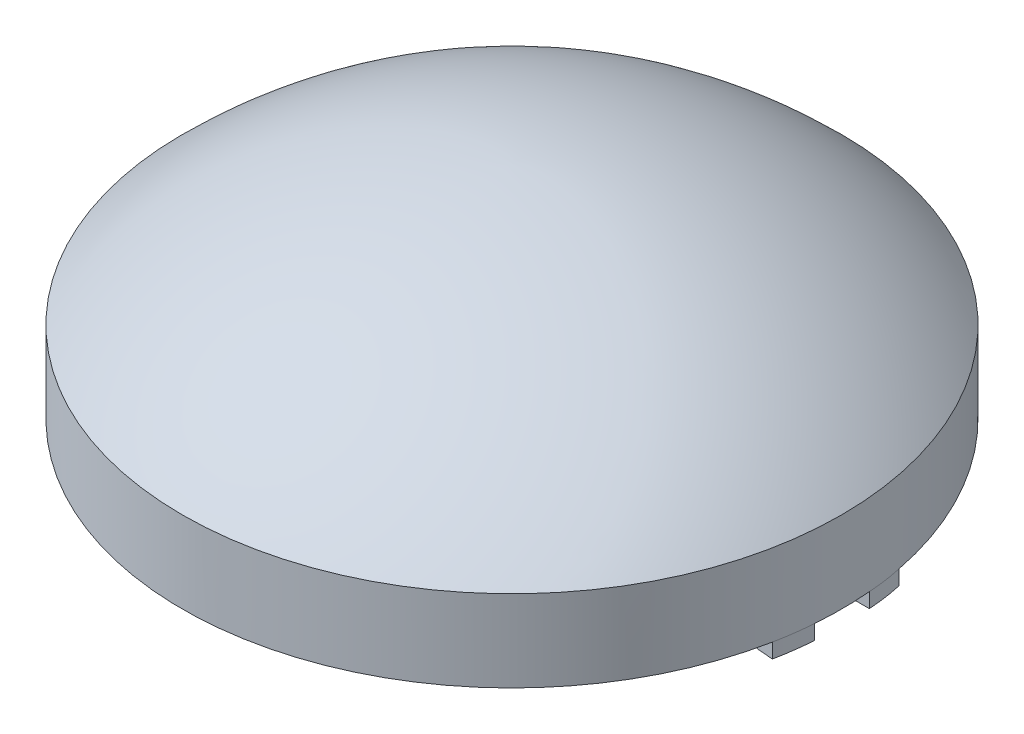
ISO-10303-21;
HEADER;
FILE_DESCRIPTION(('STEP AP214'),'2;1');
FILE_NAME('part.step','',(''),(''),'','','');
FILE_SCHEMA(('AUTOMOTIVE_DESIGN { 1 0 10303 214 1 1 1 1 }'));
ENDSEC;
DATA;
#1=APPLICATION_CONTEXT('core data for automotive mechanical design processes');
#2=APPLICATION_PROTOCOL_DEFINITION('international standard','automotive_design',2000,#1);
#3=PRODUCT_CONTEXT('',#1,'mechanical');
#4=PRODUCT('Part','Part','',(#3));
#5=PRODUCT_RELATED_PRODUCT_CATEGORY('part','',(#4));
#6=PRODUCT_DEFINITION_FORMATION('','',#4);
#7=PRODUCT_DEFINITION_CONTEXT('part definition',#1,'design');
#8=PRODUCT_DEFINITION('design','',#6,#7);
#9=PRODUCT_DEFINITION_SHAPE('','',#8);
#10=(LENGTH_UNIT() NAMED_UNIT(*) SI_UNIT(.MILLI.,.METRE.));
#11=(NAMED_UNIT(*) PLANE_ANGLE_UNIT() SI_UNIT($,.RADIAN.));
#12=(NAMED_UNIT(*) SI_UNIT($,.STERADIAN.) SOLID_ANGLE_UNIT());
#13=UNCERTAINTY_MEASURE_WITH_UNIT(LENGTH_MEASURE(1.E-05),#10,'distance_accuracy_value','');
#14=(GEOMETRIC_REPRESENTATION_CONTEXT(3) GLOBAL_UNCERTAINTY_ASSIGNED_CONTEXT((#13)) GLOBAL_UNIT_ASSIGNED_CONTEXT((#10,
#11,#12)) REPRESENTATION_CONTEXT('',''));
#15=CARTESIAN_POINT('',(0.,0.,0.));
#16=DIRECTION('',(0.,0.,1.));
#17=DIRECTION('',(1.,0.,0.));
#18=AXIS2_PLACEMENT_3D('',#15,#16,#17);
#19=CARTESIAN_POINT('',(0.,0.,0.));
#20=DIRECTION('',(0.,1.,0.));
#21=DIRECTION('',(0.,0.,1.));
#22=AXIS2_PLACEMENT_3D('',#19,#20,#21);
#23=PLANE('',#22);
#24=DIRECTION('',(-0.996339910659909,0.,-0.0854797193853873));
#25=VECTOR('',#24,1.);
#26=CARTESIAN_POINT('',(39.0657739961963,0.,7.6189622205462));
#27=LINE('',#26,#25);
#28=CARTESIAN_POINT('',(39.0657739961963,0.,7.6189622205462));
#29=VERTEX_POINT('',#28);
#30=CARTESIAN_POINT('',(37.0289275629729,0.,7.44421356330558));
#31=VERTEX_POINT('',#30);
#32=EDGE_CURVE('E221',#29,#31,#27,.T.);
#33=ORIENTED_EDGE('',*,*,#32,.F.);
#34=CARTESIAN_POINT('',(0.,0.,0.));
#35=DIRECTION('',(0.,1.,0.));
#36=DIRECTION('',(-0.979868236795601,0.,0.199645281735084));
#37=AXIS2_PLACEMENT_3D('',#34,#35,#36);
#38=CIRCLE('',#37,39.8018);
#39=CARTESIAN_POINT('',(-39.0005199266697,0.,7.94624164370193));
#40=VERTEX_POINT('',#39);
#41=EDGE_CURVE('E487',#40,#29,#38,.T.);
#42=ORIENTED_EDGE('',*,*,#41,.F.);
#43=DIRECTION('',(-0.979860848340807,0.,0.199681541182036));
#44=VECTOR('',#43,1.);
#45=CARTESIAN_POINT('',(-39.0005195872893,0.,7.94624157457244));
#46=LINE('',#45,#44);
#47=CARTESIAN_POINT('',(-37.0094423420242,0.,7.54048868259779));
#48=VERTEX_POINT('',#47);
#49=EDGE_CURVE('E329',#48,#40,#46,.T.);
#50=ORIENTED_EDGE('',*,*,#49,.F.);
#51=CARTESIAN_POINT('',(0.,0.,0.));
#52=DIRECTION('',(0.,1.,0.));
#53=DIRECTION('',(0.,0.,1.));
#54=AXIS2_PLACEMENT_3D('',#51,#52,#53);
#55=CIRCLE('',#54,37.7698);
#56=EDGE_CURVE('E405',#48,#31,#55,.T.);
#57=ORIENTED_EDGE('',*,*,#56,.T.);
#58=EDGE_LOOP('',(#33,#42,#50,#57));
#59=FACE_BOUND('',#58,.T.);
#60=ADVANCED_FACE('F35',(#59),#23,.F.);
#61=DIRECTION('',(1.,0.,0.));
#62=VECTOR('',#61,1.);
#63=CARTESIAN_POINT('',(37.6399716148533,0.,3.12895012313064));
#64=LINE('',#63,#62);
#65=CARTESIAN_POINT('',(37.6399716148533,0.,3.12895012313064));
#66=VERTEX_POINT('',#65);
#67=CARTESIAN_POINT('',(39.6788389715143,0.,3.12895009721406));
#68=VERTEX_POINT('',#67);
#69=EDGE_CURVE('E186',#66,#68,#64,.T.);
#70=ORIENTED_EDGE('',*,*,#69,.F.);
#71=CARTESIAN_POINT('',(37.6059108557315,0.,-3.51472057933188));
#72=VERTEX_POINT('',#71);
#73=EDGE_CURVE('E397',#66,#72,#55,.T.);
#74=ORIENTED_EDGE('',*,*,#73,.T.);
#75=DIRECTION('',(-1.,0.,0.));
#76=VECTOR('',#75,1.);
#77=CARTESIAN_POINT('',(39.6463115874506,0.,-3.51472057933188));
#78=LINE('',#77,#76);
#79=CARTESIAN_POINT('',(39.645807246798,0.,-3.52295182879101));
#80=VERTEX_POINT('',#79);
#81=EDGE_CURVE('E529',#80,#72,#78,.T.);
#82=ORIENTED_EDGE('',*,*,#81,.F.);
#83=CARTESIAN_POINT('',(0.,0.,0.));
#84=DIRECTION('',(0.,1.,0.));
#85=DIRECTION('',(0.996905220901253,0.,0.0786128522559997));
#86=AXIS2_PLACEMENT_3D('',#83,#84,#85);
#87=CIRCLE('',#86,39.8018);
#88=EDGE_CURVE('E460',#68,#80,#87,.T.);
#89=ORIENTED_EDGE('',*,*,#88,.F.);
#90=EDGE_LOOP('',(#70,#74,#82,#89));
#91=FACE_BOUND('',#90,.T.);
#92=ADVANCED_FACE('F567',(#91),#23,.F.);
#93=DIRECTION('',(0.983750056174884,0.,-0.179543384662071));
#94=VECTOR('',#93,1.);
#95=CARTESIAN_POINT('',(37.0548883092305,0.,-7.31389393076296));
#96=LINE('',#95,#94);
#97=CARTESIAN_POINT('',(37.0548883092305,0.,-7.31389393076296));
#98=VERTEX_POINT('',#97);
#99=CARTESIAN_POINT('',(39.0540738889318,0.,-7.67871707746343));
#100=VERTEX_POINT('',#99);
#101=EDGE_CURVE('E194',#98,#100,#96,.T.);
#102=ORIENTED_EDGE('',*,*,#101,.F.);
#103=CARTESIAN_POINT('',(-36.9543952745138,0.,-7.80579668803841));
#104=VERTEX_POINT('',#103);
#105=EDGE_CURVE('E406',#98,#104,#55,.T.);
#106=ORIENTED_EDGE('',*,*,#105,.T.);
#107=DIRECTION('',(1.,0.,0.));
#108=VECTOR('',#107,1.);
#109=CARTESIAN_POINT('',(-39.0288716376096,0.,-7.80579668803842));
#110=LINE('',#109,#108);
#111=CARTESIAN_POINT('',(-39.0288721560761,0.,-7.80579659368505));
#112=VERTEX_POINT('',#111);
#113=EDGE_CURVE('E498',#112,#104,#110,.T.);
#114=ORIENTED_EDGE('',*,*,#113,.F.);
#115=CARTESIAN_POINT('',(0.,0.,0.));
#116=DIRECTION('',(0.,1.,0.));
#117=DIRECTION('',(0.981213730430519,0.,-0.192923858593555));
#118=AXIS2_PLACEMENT_3D('',#115,#116,#117);
#119=CIRCLE('',#118,39.8018);
#120=EDGE_CURVE('E482',#100,#112,#119,.T.);
#121=ORIENTED_EDGE('',*,*,#120,.F.);
#122=EDGE_LOOP('',(#102,#106,#114,#121));
#123=FACE_BOUND('',#122,.T.);
#124=ADVANCED_FACE('F527',(#123),#23,.F.);
#125=DIRECTION('',(0.995689561977879,0.,-0.0927485642384848));
#126=VECTOR('',#125,1.);
#127=CARTESIAN_POINT('',(-39.63004826873,0.,3.69358328160203));
#128=LINE('',#127,#126);
#129=CARTESIAN_POINT('',(-39.6302767977833,0.,3.69360456483683));
#130=VERTEX_POINT('',#129);
#131=CARTESIAN_POINT('',(-37.6068070760117,0.,3.50511819881054));
#132=VERTEX_POINT('',#131);
#133=EDGE_CURVE('E306',#130,#132,#128,.T.);
#134=ORIENTED_EDGE('',*,*,#133,.F.);
#135=CARTESIAN_POINT('',(0.,0.,0.));
#136=DIRECTION('',(0.,1.,0.));
#137=DIRECTION('',(-0.995905534656943,0.,-0.0904000334052383));
#138=AXIS2_PLACEMENT_3D('',#135,#136,#137);
#139=CIRCLE('',#138,39.8018);
#140=CARTESIAN_POINT('',(-39.6390624208985,0.,-3.59810487637087));
#141=VERTEX_POINT('',#140);
#142=EDGE_CURVE('E488',#141,#130,#139,.T.);
#143=ORIENTED_EDGE('',*,*,#142,.F.);
#144=DIRECTION('',(-1.,0.,0.));
#145=VECTOR('',#144,1.);
#146=CARTESIAN_POINT('',(-39.6388310180046,0.,-3.59810488536381));
#147=LINE('',#146,#145);
#148=CARTESIAN_POINT('',(-37.5980243267372,0.,-3.59810488536381));
#149=VERTEX_POINT('',#148);
#150=EDGE_CURVE('E339',#149,#141,#147,.T.);
#151=ORIENTED_EDGE('',*,*,#150,.F.);
#152=EDGE_CURVE('E414',#149,#132,#55,.T.);
#153=ORIENTED_EDGE('',*,*,#152,.T.);
#154=EDGE_LOOP('',(#134,#143,#151,#153));
#155=FACE_BOUND('',#154,.T.);
#156=ADVANCED_FACE('F381',(#155),#23,.F.);
#157=CARTESIAN_POINT('',(0.,9.8552,0.));
#158=DIRECTION('',(0.,-1.,0.));
#159=DIRECTION('',(0.,0.,-1.));
#160=AXIS2_PLACEMENT_3D('',#157,#158,#159);
#161=CYLINDRICAL_SURFACE('',#160,39.8018);
#162=CARTESIAN_POINT('',(0.,9.8552,0.));
#163=DIRECTION('',(0.,1.,0.));
#164=DIRECTION('',(0.,0.,1.));
#165=AXIS2_PLACEMENT_3D('',#162,#163,#164);
#166=CIRCLE('',#165,39.8018);
#167=CARTESIAN_POINT('',(0.,9.8552,39.8018));
#168=VERTEX_POINT('',#167);
#169=EDGE_CURVE('E11',#168,#168,#166,.T.);
#170=ORIENTED_EDGE('',*,*,#169,.F.);
#171=EDGE_LOOP('',(#170));
#172=FACE_BOUND('',#171,.T.);
#173=CARTESIAN_POINT('',(0.,0.,0.));
#174=DIRECTION('',(0.,1.,0.));
#175=DIRECTION('',(-0.980580568609786,0.,-0.196116670543096));
#176=AXIS2_PLACEMENT_3D('',#173,#174,#175);
#177=CIRCLE('',#176,39.8018);
#178=EDGE_CURVE('E47',#112,#141,#177,.T.);
#179=ORIENTED_EDGE('',*,*,#178,.T.);
#180=ORIENTED_EDGE('',*,*,#142,.T.);
#181=CARTESIAN_POINT('',(-1.003967386232,0.,0.148619103940041));
#182=DIRECTION('',(0.,-1.,0.));
#183=DIRECTION('',(-0.988147540773018,0.,0.153507125776744));
#184=AXIS2_PLACEMENT_3D('',#181,#182,#183);
#185=CIRCLE('',#184,38.7884118695543);
#186=CARTESIAN_POINT('',(-39.3319027774762,0.,6.10280202440706));
#187=VERTEX_POINT('',#186);
#188=EDGE_CURVE('E568',#187,#130,#185,.T.);
#189=ORIENTED_EDGE('',*,*,#188,.F.);
#190=CARTESIAN_POINT('',(-1.003967386232,0.,0.148619103940041));
#191=DIRECTION('',(0.,-1.,0.));
#192=DIRECTION('',(-0.979585148493317,0.,0.201029691467024));
#193=AXIS2_PLACEMENT_3D('',#190,#191,#192);
#194=CIRCLE('',#193,38.7884118695543);
#195=EDGE_CURVE('E314',#40,#187,#194,.T.);
#196=ORIENTED_EDGE('',*,*,#195,.F.);
#197=ORIENTED_EDGE('',*,*,#41,.T.);
#198=CARTESIAN_POINT('',(0.957925034473089,0.,0.130748281442299));
#199=DIRECTION('',(0.,-1.,0.));
#200=DIRECTION('',(0.989814643666676,0.,0.142362112877727));
#201=AXIS2_PLACEMENT_3D('',#198,#199,#200);
#202=CIRCLE('',#201,38.8366000119385);
#203=CARTESIAN_POINT('',(39.3981772694796,0.,5.65949608927648));
#204=VERTEX_POINT('',#203);
#205=EDGE_CURVE('E189',#204,#29,#202,.T.);
#206=ORIENTED_EDGE('',*,*,#205,.F.);
#207=CARTESIAN_POINT('',(0.957925034473089,0.,0.130748281442299));
#208=DIRECTION('',(0.,-1.,0.));
#209=DIRECTION('',(0.997015594218302,0.,0.0772004202419027));
#210=AXIS2_PLACEMENT_3D('',#207,#208,#209);
#211=CIRCLE('',#210,38.8366000119385);
#212=EDGE_CURVE('E55',#68,#204,#211,.T.);
#213=ORIENTED_EDGE('',*,*,#212,.F.);
#214=ORIENTED_EDGE('',*,*,#88,.T.);
#215=CARTESIAN_POINT('',(13.4877975540538,0.,-1.91835709556217));
#216=DIRECTION('',(0.,-1.,0.));
#217=DIRECTION('',(0.975544765984168,0.,-0.219800840673768));
#218=AXIS2_PLACEMENT_3D('',#215,#216,#217);
#219=CIRCLE('',#218,26.2071790318556);
#220=EDGE_CURVE('E431',#100,#80,#219,.T.);
#221=ORIENTED_EDGE('',*,*,#220,.F.);
#222=ORIENTED_EDGE('',*,*,#120,.T.);
#223=EDGE_LOOP('',(#179,#180,#189,#196,#197,#206,#213,#214,#221,#222));
#224=FACE_BOUND('',#223,.T.);
#225=ADVANCED_FACE('F37',(#172,#224),#161,.T.);
#226=CARTESIAN_POINT('',(0.,9.8552,0.));
#227=DIRECTION('',(0.,-1.,0.));
#228=DIRECTION('',(0.,0.,-1.));
#229=AXIS2_PLACEMENT_3D('',#226,#227,#228);
#230=CYLINDRICAL_SURFACE('',#229,37.7698);
#231=CARTESIAN_POINT('',(0.,9.85519999999999,0.));
#232=DIRECTION('',(0.,-1.,0.));
#233=DIRECTION('',(0.,0.,-1.));
#234=AXIS2_PLACEMENT_3D('',#231,#232,#233);
#235=CIRCLE('',#234,37.7698);
#236=CARTESIAN_POINT('',(0.,9.85519999999999,-37.7698));
#237=VERTEX_POINT('',#236);
#238=EDGE_CURVE('E425',#237,#237,#235,.T.);
#239=ORIENTED_EDGE('',*,*,#238,.F.);
#240=EDGE_LOOP('',(#239));
#241=FACE_BOUND('',#240,.T.);
#242=ORIENTED_EDGE('',*,*,#152,.F.);
#243=DIRECTION('',(0.,1.,0.));
#244=VECTOR('',#243,1.);
#245=CARTESIAN_POINT('',(-37.5980243267372,-1.778,-3.59810488536381));
#246=LINE('',#245,#244);
#247=CARTESIAN_POINT('',(-37.5980243267372,-1.778,-3.59810488536381));
#248=VERTEX_POINT('',#247);
#249=EDGE_CURVE('E497',#248,#149,#246,.T.);
#250=ORIENTED_EDGE('',*,*,#249,.F.);
#251=CARTESIAN_POINT('',(9.83241266183654E-12,-1.778,1.45890244329649E-12));
#252=DIRECTION('',(0.,1.,0.));
#253=DIRECTION('',(0.,0.,-1.));
#254=AXIS2_PLACEMENT_3D('',#251,#252,#253);
#255=CIRCLE('',#254,37.7698000000099);
#256=CARTESIAN_POINT('',(-36.9543952745138,-1.778,-7.80579668803841));
#257=VERTEX_POINT('',#256);
#258=EDGE_CURVE('E341',#257,#248,#255,.T.);
#259=ORIENTED_EDGE('',*,*,#258,.F.);
#260=DIRECTION('',(0.,1.,0.));
#261=VECTOR('',#260,1.);
#262=CARTESIAN_POINT('',(-36.9543952745138,-1.778,-7.80579668803841));
#263=LINE('',#262,#261);
#264=EDGE_CURVE('E500',#257,#104,#263,.T.);
#265=ORIENTED_EDGE('',*,*,#264,.T.);
#266=ORIENTED_EDGE('',*,*,#105,.F.);
#267=CARTESIAN_POINT('',(0.0503391079749796,0.,-0.00730105759838388));
#268=DIRECTION('',(0.,1.,0.));
#269=DIRECTION('',(0.995667216727003,0.,-0.092988136528822));
#270=AXIS2_PLACEMENT_3D('',#267,#268,#269);
#271=CIRCLE('',#270,37.7190000000308);
#272=EDGE_CURVE('E191',#72,#98,#271,.T.);
#273=ORIENTED_EDGE('',*,*,#272,.F.);
#274=ORIENTED_EDGE('',*,*,#73,.F.);
#275=CARTESIAN_POINT('',(0.0503822833158238,0.,0.00713416341021483));
#276=DIRECTION('',(0.,1.,0.));
#277=DIRECTION('',(0.980369184751905,0.,0.197170640788339));
#278=AXIS2_PLACEMENT_3D('',#275,#276,#277);
#279=CIRCLE('',#278,37.719);
#280=EDGE_CURVE('E216',#31,#66,#279,.T.);
#281=ORIENTED_EDGE('',*,*,#280,.F.);
#282=ORIENTED_EDGE('',*,*,#56,.F.);
#283=CARTESIAN_POINT('',(-0.0503259154624389,0.,0.00744985552724939));
#284=DIRECTION('',(0.,1.,0.));
#285=DIRECTION('',(-0.995691326931227,0.,0.092729614869971));
#286=AXIS2_PLACEMENT_3D('',#283,#284,#285);
#287=CIRCLE('',#286,37.7190000000305);
#288=EDGE_CURVE('E313',#132,#48,#287,.T.);
#289=ORIENTED_EDGE('',*,*,#288,.F.);
#290=EDGE_LOOP('',(#242,#250,#259,#265,#266,#273,#274,#281,#282,#289));
#291=FACE_BOUND('',#290,.T.);
#292=ADVANCED_FACE('F373',(#241,#291),#230,.F.);
#293=CARTESIAN_POINT('',(0.,-31.0948418990091,2.31510652263877));
#294=DIRECTION('',(-1.,0.,0.));
#295=DIRECTION('',(0.,0.,-1.));
#296=AXIS2_PLACEMENT_3D('',#293,#294,#295);
#297=CIRCLE('',#296,57.3036269572816);
#298=TRIMMED_CURVE('',#297,(PARAMETER_VALUE(-1.53038463034389)),
(PARAMETER_VALUE(1.53038463034389)),.T.,.PARAMETER.);
#299=CARTESIAN_POINT('',(0.,-31.0948418990091,0.));
#300=DIRECTION('',(0.,-1.,0.));
#301=AXIS1_PLACEMENT('',#299,#300);
#302=SURFACE_OF_REVOLUTION('',#298,#301);
#303=CARTESIAN_POINT('',(0.,26.162,0.));
#304=VERTEX_POINT('',#303);
#305=VERTEX_LOOP('',#304);
#306=FACE_BOUND('',#305,.T.);
#307=ORIENTED_EDGE('',*,*,#238,.T.);
#308=EDGE_LOOP('',(#307));
#309=FACE_BOUND('',#308,.T.);
#310=ADVANCED_FACE('F370',(#306,#309),#302,.F.);
#311=CARTESIAN_POINT('',(0.,-31.0947213037108,1.03869773865875));
#312=DIRECTION('',(-1.,0.,0.));
#313=DIRECTION('',(0.,0.,-1.));
#314=AXIS2_PLACEMENT_3D('',#311,#312,#313);
#315=CIRCLE('',#314,57.8346116985452);
#316=TRIMMED_CURVE('',#315,(PARAMETER_VALUE(-1.55283556669558)),
(PARAMETER_VALUE(1.55283556669558)),.T.,.PARAMETER.);
#317=CARTESIAN_POINT('',(0.,-31.0947213037108,0.));
#318=DIRECTION('',(0.,-1.,0.));
#319=AXIS1_PLACEMENT('',#317,#318);
#320=SURFACE_OF_REVOLUTION('',#316,#319);
#321=ORIENTED_EDGE('',*,*,#169,.T.);
#322=EDGE_LOOP('',(#321));
#323=FACE_BOUND('',#322,.T.);
#324=CARTESIAN_POINT('',(0.,26.73056224362,0.));
#325=VERTEX_POINT('',#324);
#326=VERTEX_LOOP('',#325);
#327=FACE_BOUND('',#326,.T.);
#328=ADVANCED_FACE('F368',(#323,#327),#320,.T.);
#329=CARTESIAN_POINT('',(1.80164288038569,-1.778,0.261171451367767));
#330=DIRECTION('',(0.,1.,0.));
#331=DIRECTION('',(0.,0.,1.));
#332=AXIS2_PLACEMENT_3D('',#329,#330,#331);
#333=CYLINDRICAL_SURFACE('',#332,41.6197896530775);
#334=ORIENTED_EDGE('',*,*,#178,.F.);
#335=DIRECTION('',(0.,1.,0.));
#336=VECTOR('',#335,1.);
#337=CARTESIAN_POINT('',(-39.0288716376096,-1.778,-7.80579668803842));
#338=LINE('',#337,#336);
#339=CARTESIAN_POINT('',(-39.0288716376096,-1.778,-7.80579668803842));
#340=VERTEX_POINT('',#339);
#341=EDGE_CURVE('E510',#340,#112,#338,.T.);
#342=ORIENTED_EDGE('',*,*,#341,.F.);
#343=CARTESIAN_POINT('',(1.80164288038569,-1.778,0.261171451367767));
#344=DIRECTION('',(0.,-1.,0.));
#345=DIRECTION('',(0.,0.,-1.));
#346=AXIS2_PLACEMENT_3D('',#343,#344,#345);
#347=CIRCLE('',#346,41.6197896530775);
#348=CARTESIAN_POINT('',(-39.6388310180046,-1.778,-3.59810488536381));
#349=VERTEX_POINT('',#348);
#350=EDGE_CURVE('E335',#349,#340,#347,.T.);
#351=ORIENTED_EDGE('',*,*,#350,.F.);
#352=DIRECTION('',(0.,1.,0.));
#353=VECTOR('',#352,1.);
#354=CARTESIAN_POINT('',(-39.6388310180046,-1.778,-3.59810488536381));
#355=LINE('',#354,#353);
#356=EDGE_CURVE('E345',#349,#141,#355,.T.);
#357=ORIENTED_EDGE('',*,*,#356,.T.);
#358=EDGE_LOOP('',(#334,#342,#351,#357));
#359=FACE_BOUND('',#358,.T.);
#360=ADVANCED_FACE('F357',(#359),#333,.T.);
#361=CARTESIAN_POINT('',(-39.0288716376096,-1.778,-7.80579668803842));
#362=DIRECTION('',(0.,0.,1.));
#363=DIRECTION('',(1.,0.,0.));
#364=AXIS2_PLACEMENT_3D('',#361,#362,#363);
#365=PLANE('',#364);
#366=ORIENTED_EDGE('',*,*,#113,.T.);
#367=ORIENTED_EDGE('',*,*,#264,.F.);
#368=DIRECTION('',(1.,0.,0.));
#369=VECTOR('',#368,1.);
#370=CARTESIAN_POINT('',(-39.0288716376096,-1.778,-7.80579668803842));
#371=LINE('',#370,#369);
#372=EDGE_CURVE('E338',#340,#257,#371,.T.);
#373=ORIENTED_EDGE('',*,*,#372,.F.);
#374=ORIENTED_EDGE('',*,*,#341,.T.);
#375=EDGE_LOOP('',(#366,#367,#373,#374));
#376=FACE_BOUND('',#375,.T.);
#377=ADVANCED_FACE('F367',(#376),#365,.F.);
#378=CARTESIAN_POINT('',(-39.6388310180046,-1.778,-3.59810488536381));
#379=DIRECTION('',(0.,0.,-1.));
#380=DIRECTION('',(-1.,0.,0.));
#381=AXIS2_PLACEMENT_3D('',#378,#379,#380);
#382=PLANE('',#381);
#383=ORIENTED_EDGE('',*,*,#150,.T.);
#384=ORIENTED_EDGE('',*,*,#356,.F.);
#385=DIRECTION('',(-1.,0.,0.));
#386=VECTOR('',#385,1.);
#387=CARTESIAN_POINT('',(-39.6388310180046,-1.778,-3.59810488536381));
#388=LINE('',#387,#386);
#389=EDGE_CURVE('E343',#248,#349,#388,.T.);
#390=ORIENTED_EDGE('',*,*,#389,.F.);
#391=ORIENTED_EDGE('',*,*,#249,.T.);
#392=EDGE_LOOP('',(#383,#384,#390,#391));
#393=FACE_BOUND('',#392,.T.);
#394=ADVANCED_FACE('F493',(#393),#382,.F.);
#395=CARTESIAN_POINT('',(1.80164288038569,-1.778,0.261171451367767));
#396=DIRECTION('',(0.,-1.,0.));
#397=DIRECTION('',(0.,0.,-1.));
#398=AXIS2_PLACEMENT_3D('',#395,#396,#397);
#399=PLANE('',#398);
#400=ORIENTED_EDGE('',*,*,#350,.T.);
#401=ORIENTED_EDGE('',*,*,#372,.T.);
#402=ORIENTED_EDGE('',*,*,#258,.T.);
#403=ORIENTED_EDGE('',*,*,#389,.T.);
#404=EDGE_LOOP('',(#400,#401,#402,#403));
#405=FACE_BOUND('',#404,.T.);
#406=ADVANCED_FACE('F601',(#405),#399,.T.);
#407=CARTESIAN_POINT('',(-1.003967386232,-1.778,0.148619103940041));
#408=DIRECTION('',(0.,1.,0.));
#409=DIRECTION('',(0.,0.,1.));
#410=AXIS2_PLACEMENT_3D('',#407,#408,#409);
#411=CYLINDRICAL_SURFACE('',#410,38.7884118695543);
#412=ORIENTED_EDGE('',*,*,#195,.T.);
#413=ORIENTED_EDGE('',*,*,#188,.T.);
#414=DIRECTION('',(0.,1.,0.));
#415=VECTOR('',#414,1.);
#416=CARTESIAN_POINT('',(-39.63004826873,-1.778,3.69358328160203));
#417=LINE('',#416,#415);
#418=CARTESIAN_POINT('',(-39.63004826873,-1.778,3.69358328160203));
#419=VERTEX_POINT('',#418);
#420=EDGE_CURVE('E320',#419,#130,#417,.T.);
#421=ORIENTED_EDGE('',*,*,#420,.F.);
#422=CARTESIAN_POINT('',(-1.003967386232,-1.778,0.148619103940041));
#423=DIRECTION('',(0.,-1.,0.));
#424=DIRECTION('',(0.,0.,-1.));
#425=AXIS2_PLACEMENT_3D('',#422,#423,#424);
#426=CIRCLE('',#425,38.7884118695543);
#427=CARTESIAN_POINT('',(-39.0005195872893,-1.778,7.94624157457244));
#428=VERTEX_POINT('',#427);
#429=EDGE_CURVE('E332',#428,#419,#426,.T.);
#430=ORIENTED_EDGE('',*,*,#429,.F.);
#431=DIRECTION('',(0.,1.,0.));
#432=VECTOR('',#431,1.);
#433=CARTESIAN_POINT('',(-39.0005195872893,-1.778,7.94624157457244));
#434=LINE('',#433,#432);
#435=EDGE_CURVE('E326',#428,#40,#434,.T.);
#436=ORIENTED_EDGE('',*,*,#435,.T.);
#437=EDGE_LOOP('',(#412,#413,#421,#430,#436));
#438=FACE_BOUND('',#437,.T.);
#439=ADVANCED_FACE('F592',(#438),#411,.T.);
#440=CARTESIAN_POINT('',(-39.63004826873,-1.778,3.69358328160203));
#441=DIRECTION('',(0.0927485642384848,0.,0.995689561977879));
#442=DIRECTION('',(0.995689561977879,0.,-0.0927485642384848));
#443=AXIS2_PLACEMENT_3D('',#440,#441,#442);
#444=PLANE('',#443);
#445=ORIENTED_EDGE('',*,*,#133,.T.);
#446=DIRECTION('',(0.,1.,0.));
#447=VECTOR('',#446,1.);
#448=CARTESIAN_POINT('',(-37.6068070760117,-1.778,3.50511819881054));
#449=LINE('',#448,#447);
#450=CARTESIAN_POINT('',(-37.6068070760117,-1.778,3.50511819881054));
#451=VERTEX_POINT('',#450);
#452=EDGE_CURVE('E317',#451,#132,#449,.T.);
#453=ORIENTED_EDGE('',*,*,#452,.F.);
#454=DIRECTION('',(0.995689561977879,0.,-0.0927485642384848));
#455=VECTOR('',#454,1.);
#456=CARTESIAN_POINT('',(-39.63004826873,-1.778,3.69358328160203));
#457=LINE('',#456,#455);
#458=EDGE_CURVE('E576',#419,#451,#457,.T.);
#459=ORIENTED_EDGE('',*,*,#458,.F.);
#460=ORIENTED_EDGE('',*,*,#420,.T.);
#461=EDGE_LOOP('',(#445,#453,#459,#460));
#462=FACE_BOUND('',#461,.T.);
#463=ADVANCED_FACE('F297',(#462),#444,.F.);
#464=CARTESIAN_POINT('',(-0.0503259154624389,-1.778,0.00744985552724939));
#465=DIRECTION('',(0.,1.,0.));
#466=DIRECTION('',(0.,0.,1.));
#467=AXIS2_PLACEMENT_3D('',#464,#465,#466);
#468=CYLINDRICAL_SURFACE('',#467,37.7190000000305);
#469=ORIENTED_EDGE('',*,*,#288,.T.);
#470=DIRECTION('',(0.,1.,0.));
#471=VECTOR('',#470,1.);
#472=CARTESIAN_POINT('',(-37.0094423420242,-1.778,7.54048868259779));
#473=LINE('',#472,#471);
#474=CARTESIAN_POINT('',(-37.0094423420242,-1.778,7.54048868259779));
#475=VERTEX_POINT('',#474);
#476=EDGE_CURVE('E321',#475,#48,#473,.T.);
#477=ORIENTED_EDGE('',*,*,#476,.F.);
#478=CARTESIAN_POINT('',(-0.0503259154624389,-1.778,0.00744985552724939));
#479=DIRECTION('',(0.,1.,0.));
#480=DIRECTION('',(0.,0.,-1.));
#481=AXIS2_PLACEMENT_3D('',#478,#479,#480);
#482=CIRCLE('',#481,37.7190000000305);
#483=EDGE_CURVE('E578',#451,#475,#482,.T.);
#484=ORIENTED_EDGE('',*,*,#483,.F.);
#485=ORIENTED_EDGE('',*,*,#452,.T.);
#486=EDGE_LOOP('',(#469,#477,#484,#485));
#487=FACE_BOUND('',#486,.T.);
#488=ADVANCED_FACE('F292',(#487),#468,.F.);
#489=CARTESIAN_POINT('',(-39.0005195872893,-1.778,7.94624157457244));
#490=DIRECTION('',(-0.199681541182036,0.,-0.979860848340807));
#491=DIRECTION('',(-0.979860848340807,0.,0.199681541182036));
#492=AXIS2_PLACEMENT_3D('',#489,#490,#491);
#493=PLANE('',#492);
#494=ORIENTED_EDGE('',*,*,#49,.T.);
#495=ORIENTED_EDGE('',*,*,#435,.F.);
#496=DIRECTION('',(-0.979860848340807,0.,0.199681541182036));
#497=VECTOR('',#496,1.);
#498=CARTESIAN_POINT('',(-39.0005195872893,-1.778,7.94624157457244));
#499=LINE('',#498,#497);
#500=EDGE_CURVE('E579',#475,#428,#499,.T.);
#501=ORIENTED_EDGE('',*,*,#500,.F.);
#502=ORIENTED_EDGE('',*,*,#476,.T.);
#503=EDGE_LOOP('',(#494,#495,#501,#502));
#504=FACE_BOUND('',#503,.T.);
#505=ADVANCED_FACE('F288',(#504),#493,.F.);
#506=CARTESIAN_POINT('',(-1.003967386232,-1.778,0.148619103940041));
#507=DIRECTION('',(0.,-1.,0.));
#508=DIRECTION('',(0.,0.,-1.));
#509=AXIS2_PLACEMENT_3D('',#506,#507,#508);
#510=PLANE('',#509);
#511=ORIENTED_EDGE('',*,*,#429,.T.);
#512=ORIENTED_EDGE('',*,*,#458,.T.);
#513=ORIENTED_EDGE('',*,*,#483,.T.);
#514=ORIENTED_EDGE('',*,*,#500,.T.);
#515=EDGE_LOOP('',(#511,#512,#513,#514));
#516=FACE_BOUND('',#515,.T.);
#517=ADVANCED_FACE('F285',(#516),#510,.T.);
#518=CARTESIAN_POINT('',(0.0503391079749796,-1.778,-0.00730105759838388));
#519=DIRECTION('',(0.,1.,0.));
#520=DIRECTION('',(0.,0.,1.));
#521=AXIS2_PLACEMENT_3D('',#518,#519,#520);
#522=CYLINDRICAL_SURFACE('',#521,37.7190000000308);
#523=ORIENTED_EDGE('',*,*,#272,.T.);
#524=DIRECTION('',(0.,1.,0.));
#525=VECTOR('',#524,1.);
#526=CARTESIAN_POINT('',(37.0548883092305,-1.778,-7.31389393076296));
#527=LINE('',#526,#525);
#528=CARTESIAN_POINT('',(37.0548883092305,-1.778,-7.31389393076296));
#529=VERTEX_POINT('',#528);
#530=EDGE_CURVE('E541',#529,#98,#527,.T.);
#531=ORIENTED_EDGE('',*,*,#530,.F.);
#532=CARTESIAN_POINT('',(0.0503391079749796,-1.778,-0.00730105759838388));
#533=DIRECTION('',(0.,1.,0.));
#534=DIRECTION('',(0.,0.,-1.));
#535=AXIS2_PLACEMENT_3D('',#532,#533,#534);
#536=CIRCLE('',#535,37.7190000000308);
#537=CARTESIAN_POINT('',(37.6059108557315,-1.778,-3.51472057933188));
#538=VERTEX_POINT('',#537);
#539=EDGE_CURVE('E532',#538,#529,#536,.T.);
#540=ORIENTED_EDGE('',*,*,#539,.F.);
#541=DIRECTION('',(0.,1.,0.));
#542=VECTOR('',#541,1.);
#543=CARTESIAN_POINT('',(37.6059108557315,-1.778,-3.51472057933188));
#544=LINE('',#543,#542);
#545=EDGE_CURVE('E274',#538,#72,#544,.T.);
#546=ORIENTED_EDGE('',*,*,#545,.T.);
#547=EDGE_LOOP('',(#523,#531,#540,#546));
#548=FACE_BOUND('',#547,.T.);
#549=ADVANCED_FACE('F276',(#548),#522,.F.);
#550=CARTESIAN_POINT('',(37.0548883092305,-1.778,-7.31389393076296));
#551=DIRECTION('',(0.179543384662071,0.,0.983750056174884));
#552=DIRECTION('',(0.983750056174884,0.,-0.179543384662071));
#553=AXIS2_PLACEMENT_3D('',#550,#551,#552);
#554=PLANE('',#553);
#555=ORIENTED_EDGE('',*,*,#101,.T.);
#556=DIRECTION('',(0.,1.,0.));
#557=VECTOR('',#556,1.);
#558=CARTESIAN_POINT('',(39.0540638245614,-1.778,-7.67876175089983));
#559=LINE('',#558,#557);
#560=CARTESIAN_POINT('',(39.0540638245614,-1.778,-7.67876175089983));
#561=VERTEX_POINT('',#560);
#562=EDGE_CURVE('E63',#561,#100,#559,.T.);
#563=ORIENTED_EDGE('',*,*,#562,.F.);
#564=DIRECTION('',(0.983750056174884,0.,-0.179543384662071));
#565=VECTOR('',#564,1.);
#566=CARTESIAN_POINT('',(37.0548883092305,-1.778,-7.31389393076296));
#567=LINE('',#566,#565);
#568=EDGE_CURVE('E555',#529,#561,#567,.T.);
#569=ORIENTED_EDGE('',*,*,#568,.F.);
#570=ORIENTED_EDGE('',*,*,#530,.T.);
#571=EDGE_LOOP('',(#555,#563,#569,#570));
#572=FACE_BOUND('',#571,.T.);
#573=ADVANCED_FACE('F252',(#572),#554,.F.);
#574=CARTESIAN_POINT('',(13.4877975540538,-1.778,-1.91835709556217));
#575=DIRECTION('',(0.,1.,0.));
#576=DIRECTION('',(0.,0.,1.));
#577=AXIS2_PLACEMENT_3D('',#574,#575,#576);
#578=CYLINDRICAL_SURFACE('',#577,26.2071790318556);
#579=ORIENTED_EDGE('',*,*,#220,.T.);
#580=DIRECTION('',(0.,1.,0.));
#581=VECTOR('',#580,1.);
#582=CARTESIAN_POINT('',(39.6463115874506,-1.778,-3.51472057933189));
#583=LINE('',#582,#581);
#584=CARTESIAN_POINT('',(39.6463115874506,-1.778,-3.51472057933189));
#585=VERTEX_POINT('',#584);
#586=EDGE_CURVE('E542',#585,#80,#583,.T.);
#587=ORIENTED_EDGE('',*,*,#586,.F.);
#588=CARTESIAN_POINT('',(13.4877975540538,-1.778,-1.91835709556217));
#589=DIRECTION('',(0.,-1.,0.));
#590=DIRECTION('',(0.,0.,-1.));
#591=AXIS2_PLACEMENT_3D('',#588,#589,#590);
#592=CIRCLE('',#591,26.2071790318556);
#593=EDGE_CURVE('E553',#561,#585,#592,.T.);
#594=ORIENTED_EDGE('',*,*,#593,.F.);
#595=ORIENTED_EDGE('',*,*,#562,.T.);
#596=EDGE_LOOP('',(#579,#587,#594,#595));
#597=FACE_BOUND('',#596,.T.);
#598=ADVANCED_FACE('F247',(#597),#578,.T.);
#599=CARTESIAN_POINT('',(39.6463115874506,-1.778,-3.51472057933188));
#600=DIRECTION('',(0.,0.,-1.));
#601=DIRECTION('',(-1.,0.,0.));
#602=AXIS2_PLACEMENT_3D('',#599,#600,#601);
#603=PLANE('',#602);
#604=ORIENTED_EDGE('',*,*,#81,.T.);
#605=ORIENTED_EDGE('',*,*,#545,.F.);
#606=DIRECTION('',(-1.,0.,0.));
#607=VECTOR('',#606,1.);
#608=CARTESIAN_POINT('',(39.6463115874506,-1.778,-3.51472057933188));
#609=LINE('',#608,#607);
#610=EDGE_CURVE('E536',#585,#538,#609,.T.);
#611=ORIENTED_EDGE('',*,*,#610,.F.);
#612=ORIENTED_EDGE('',*,*,#586,.T.);
#613=EDGE_LOOP('',(#604,#605,#611,#612));
#614=FACE_BOUND('',#613,.T.);
#615=ADVANCED_FACE('F243',(#614),#603,.F.);
#616=CARTESIAN_POINT('',(0.0503391079749796,-1.778,-0.00730105759838388));
#617=DIRECTION('',(0.,-1.,0.));
#618=DIRECTION('',(0.,0.,-1.));
#619=AXIS2_PLACEMENT_3D('',#616,#617,#618);
#620=PLANE('',#619);
#621=ORIENTED_EDGE('',*,*,#539,.T.);
#622=ORIENTED_EDGE('',*,*,#568,.T.);
#623=ORIENTED_EDGE('',*,*,#593,.T.);
#624=ORIENTED_EDGE('',*,*,#610,.T.);
#625=EDGE_LOOP('',(#621,#622,#623,#624));
#626=FACE_BOUND('',#625,.T.);
#627=ADVANCED_FACE('F239',(#626),#620,.T.);
#628=CARTESIAN_POINT('',(0.957925034473089,-1.778,0.130748281442299));
#629=DIRECTION('',(0.,1.,0.));
#630=DIRECTION('',(0.,0.,1.));
#631=AXIS2_PLACEMENT_3D('',#628,#629,#630);
#632=CYLINDRICAL_SURFACE('',#631,38.8366000119385);
#633=ORIENTED_EDGE('',*,*,#212,.T.);
#634=ORIENTED_EDGE('',*,*,#205,.T.);
#635=DIRECTION('',(0.,1.,0.));
#636=VECTOR('',#635,1.);
#637=CARTESIAN_POINT('',(39.0657739961963,-1.778,7.6189622205462));
#638=LINE('',#637,#636);
#639=CARTESIAN_POINT('',(39.0657739961963,-1.778,7.6189622205462));
#640=VERTEX_POINT('',#639);
#641=EDGE_CURVE('E172',#640,#29,#638,.T.);
#642=ORIENTED_EDGE('',*,*,#641,.F.);
#643=CARTESIAN_POINT('',(0.957925034473089,-1.778,0.130748281442299));
#644=DIRECTION('',(0.,-1.,0.));
#645=DIRECTION('',(0.,0.,1.));
#646=AXIS2_PLACEMENT_3D('',#643,#644,#645);
#647=CIRCLE('',#646,38.8366000119385);
#648=CARTESIAN_POINT('',(39.6786208727945,-1.778,3.12895012313064));
#649=VERTEX_POINT('',#648);
#650=EDGE_CURVE('E179',#649,#640,#647,.T.);
#651=ORIENTED_EDGE('',*,*,#650,.F.);
#652=DIRECTION('',(0.,1.,0.));
#653=VECTOR('',#652,1.);
#654=CARTESIAN_POINT('',(39.6786208727945,-1.778,3.12895012313064));
#655=LINE('',#654,#653);
#656=EDGE_CURVE('E203',#649,#68,#655,.T.);
#657=ORIENTED_EDGE('',*,*,#656,.T.);
#658=EDGE_LOOP('',(#633,#634,#642,#651,#657));
#659=FACE_BOUND('',#658,.T.);
#660=ADVANCED_FACE('F188',(#659),#632,.T.);
#661=CARTESIAN_POINT('',(39.0657739961963,-1.778,7.6189622205462));
#662=DIRECTION('',(0.0854797193853873,0.,-0.996339910659909));
#663=DIRECTION('',(-0.996339910659909,0.,-0.0854797193853873));
#664=AXIS2_PLACEMENT_3D('',#661,#662,#663);
#665=PLANE('',#664);
#666=ORIENTED_EDGE('',*,*,#32,.T.);
#667=DIRECTION('',(0.,1.,0.));
#668=VECTOR('',#667,1.);
#669=CARTESIAN_POINT('',(37.0289275629729,-1.778,7.44421356330558));
#670=LINE('',#669,#668);
#671=CARTESIAN_POINT('',(37.0289275629729,-1.778,7.44421356330558));
#672=VERTEX_POINT('',#671);
#673=EDGE_CURVE('E175',#672,#31,#670,.T.);
#674=ORIENTED_EDGE('',*,*,#673,.F.);
#675=DIRECTION('',(-0.996339910659909,0.,-0.0854797193853873));
#676=VECTOR('',#675,1.);
#677=CARTESIAN_POINT('',(39.0657739961963,-1.778,7.6189622205462));
#678=LINE('',#677,#676);
#679=EDGE_CURVE('E168',#640,#672,#678,.T.);
#680=ORIENTED_EDGE('',*,*,#679,.F.);
#681=ORIENTED_EDGE('',*,*,#641,.T.);
#682=EDGE_LOOP('',(#666,#674,#680,#681));
#683=FACE_BOUND('',#682,.T.);
#684=ADVANCED_FACE('F170',(#683),#665,.F.);
#685=CARTESIAN_POINT('',(0.0503822833158238,-1.778,0.00713416341021483));
#686=DIRECTION('',(0.,1.,0.));
#687=DIRECTION('',(0.,0.,1.));
#688=AXIS2_PLACEMENT_3D('',#685,#686,#687);
#689=CYLINDRICAL_SURFACE('',#688,37.719);
#690=ORIENTED_EDGE('',*,*,#280,.T.);
#691=DIRECTION('',(0.,1.,0.));
#692=VECTOR('',#691,1.);
#693=CARTESIAN_POINT('',(37.6399716148533,-1.778,3.12895012313064));
#694=LINE('',#693,#692);
#695=CARTESIAN_POINT('',(37.6399716148533,-1.778,3.12895012313064));
#696=VERTEX_POINT('',#695);
#697=EDGE_CURVE('E195',#696,#66,#694,.T.);
#698=ORIENTED_EDGE('',*,*,#697,.F.);
#699=CARTESIAN_POINT('',(0.0503822833158238,-1.778,0.00713416341021483));
#700=DIRECTION('',(0.,1.,0.));
#701=DIRECTION('',(0.,0.,-1.));
#702=AXIS2_PLACEMENT_3D('',#699,#700,#701);
#703=CIRCLE('',#702,37.719);
#704=EDGE_CURVE('E178',#672,#696,#703,.T.);
#705=ORIENTED_EDGE('',*,*,#704,.F.);
#706=ORIENTED_EDGE('',*,*,#673,.T.);
#707=EDGE_LOOP('',(#690,#698,#705,#706));
#708=FACE_BOUND('',#707,.T.);
#709=ADVANCED_FACE('F223',(#708),#689,.F.);
#710=CARTESIAN_POINT('',(37.6399716148533,-1.778,3.12895012313064));
#711=DIRECTION('',(0.,0.,1.));
#712=DIRECTION('',(1.,0.,0.));
#713=AXIS2_PLACEMENT_3D('',#710,#711,#712);
#714=PLANE('',#713);
#715=ORIENTED_EDGE('',*,*,#69,.T.);
#716=ORIENTED_EDGE('',*,*,#656,.F.);
#717=DIRECTION('',(1.,0.,0.));
#718=VECTOR('',#717,1.);
#719=CARTESIAN_POINT('',(37.6399716148533,-1.778,3.12895012313064));
#720=LINE('',#719,#718);
#721=EDGE_CURVE('E184',#696,#649,#720,.T.);
#722=ORIENTED_EDGE('',*,*,#721,.F.);
#723=ORIENTED_EDGE('',*,*,#697,.T.);
#724=EDGE_LOOP('',(#715,#716,#722,#723));
#725=FACE_BOUND('',#724,.T.);
#726=ADVANCED_FACE('F233',(#725),#714,.F.);
#727=CARTESIAN_POINT('',(0.957925034473089,-1.778,0.130748281442299));
#728=DIRECTION('',(0.,1.,0.));
#729=DIRECTION('',(0.,0.,1.));
#730=AXIS2_PLACEMENT_3D('',#727,#728,#729);
#731=PLANE('',#730);
#732=ORIENTED_EDGE('',*,*,#650,.T.);
#733=ORIENTED_EDGE('',*,*,#679,.T.);
#734=ORIENTED_EDGE('',*,*,#704,.T.);
#735=ORIENTED_EDGE('',*,*,#721,.T.);
#736=EDGE_LOOP('',(#732,#733,#734,#735));
#737=FACE_BOUND('',#736,.T.);
#738=ADVANCED_FACE('F182',(#737),#731,.F.);
#739=CLOSED_SHELL('',(#60,#92,#124,#156,#225,#292,#310,#328,#360,#377,#394,#406,#439,#463,#488,
#505,#517,#549,#573,#598,#615,#627,#660,#684,#709,#726,#738));
#740=MANIFOLD_SOLID_BREP('B2',#739);
#741=ADVANCED_BREP_SHAPE_REPRESENTATION('',(#18,#740),#14);
#742=SHAPE_DEFINITION_REPRESENTATION(#9,#741);
ENDSEC;
END-ISO-10303-21;
